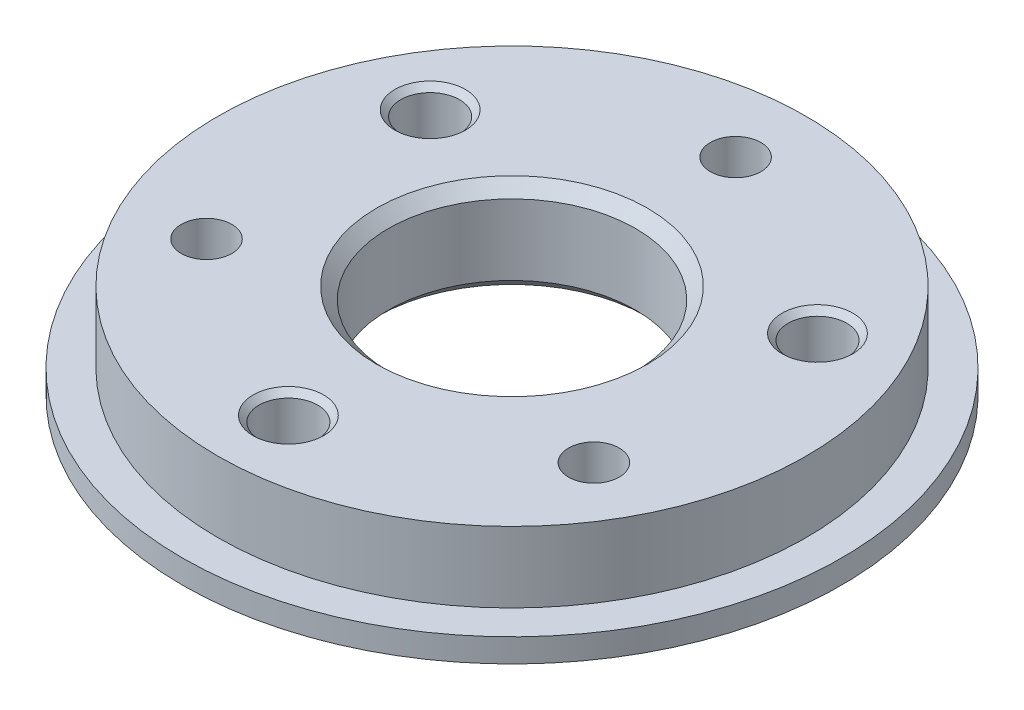
ISO-10303-21;
HEADER;
FILE_DESCRIPTION(('STEP AP214'),'2;1');
FILE_NAME('part.step','',(''),(''),'','','');
FILE_SCHEMA(('AUTOMOTIVE_DESIGN { 1 0 10303 214 1 1 1 1 }'));
ENDSEC;
DATA;
#1=APPLICATION_CONTEXT('core data for automotive mechanical design processes');
#2=APPLICATION_PROTOCOL_DEFINITION('international standard','automotive_design',2000,#1);
#3=PRODUCT_CONTEXT('',#1,'mechanical');
#4=PRODUCT('Part','Part','',(#3));
#5=PRODUCT_RELATED_PRODUCT_CATEGORY('part','',(#4));
#6=PRODUCT_DEFINITION_FORMATION('','',#4);
#7=PRODUCT_DEFINITION_CONTEXT('part definition',#1,'design');
#8=PRODUCT_DEFINITION('design','',#6,#7);
#9=PRODUCT_DEFINITION_SHAPE('','',#8);
#10=(LENGTH_UNIT() NAMED_UNIT(*) SI_UNIT(.MILLI.,.METRE.));
#11=(NAMED_UNIT(*) PLANE_ANGLE_UNIT() SI_UNIT($,.RADIAN.));
#12=(NAMED_UNIT(*) SI_UNIT($,.STERADIAN.) SOLID_ANGLE_UNIT());
#13=UNCERTAINTY_MEASURE_WITH_UNIT(LENGTH_MEASURE(1.E-05),#10,'distance_accuracy_value','');
#14=(GEOMETRIC_REPRESENTATION_CONTEXT(3) GLOBAL_UNCERTAINTY_ASSIGNED_CONTEXT((#13)) GLOBAL_UNIT_ASSIGNED_CONTEXT((#10,
#11,#12)) REPRESENTATION_CONTEXT('',''));
#15=CARTESIAN_POINT('',(0.,0.,0.));
#16=DIRECTION('',(0.,0.,1.));
#17=DIRECTION('',(1.,0.,0.));
#18=AXIS2_PLACEMENT_3D('',#15,#16,#17);
#19=CARTESIAN_POINT('',(0.,6.,0.));
#20=DIRECTION('',(0.,1.,0.));
#21=DIRECTION('',(0.,0.,1.));
#22=AXIS2_PLACEMENT_3D('',#19,#20,#21);
#23=PLANE('',#22);
#24=CARTESIAN_POINT('',(16.4544826719043,6.,-9.50000000000001));
#25=DIRECTION('',(0.,1.,0.));
#26=DIRECTION('',(0.,0.,1.));
#27=AXIS2_PLACEMENT_3D('',#24,#25,#26);
#28=CIRCLE('',#27,3.00000000000001);
#29=CARTESIAN_POINT('',(16.4544826719043,6.,-6.5));
#30=VERTEX_POINT('',#29);
#31=EDGE_CURVE('E287',#30,#30,#28,.F.);
#32=ORIENTED_EDGE('',*,*,#31,.T.);
#33=EDGE_LOOP('',(#32));
#34=FACE_BOUND('',#33,.T.);
#35=CARTESIAN_POINT('',(-16.4544826719043,6.,-9.5));
#36=DIRECTION('',(0.,1.,0.));
#37=DIRECTION('',(0.,0.,1.));
#38=AXIS2_PLACEMENT_3D('',#35,#36,#37);
#39=CIRCLE('',#38,3.00000000000001);
#40=CARTESIAN_POINT('',(-16.4544826719043,6.,-6.49999999999999));
#41=VERTEX_POINT('',#40);
#42=EDGE_CURVE('E284',#41,#41,#39,.F.);
#43=ORIENTED_EDGE('',*,*,#42,.T.);
#44=EDGE_LOOP('',(#43));
#45=FACE_BOUND('',#44,.T.);
#46=CARTESIAN_POINT('',(0.,6.,19.));
#47=DIRECTION('',(0.,1.,0.));
#48=DIRECTION('',(0.,0.,1.));
#49=AXIS2_PLACEMENT_3D('',#46,#47,#48);
#50=CIRCLE('',#49,3.00000000000001);
#51=CARTESIAN_POINT('',(0.,6.,22.));
#52=VERTEX_POINT('',#51);
#53=EDGE_CURVE('E281',#52,#52,#50,.F.);
#54=ORIENTED_EDGE('',*,*,#53,.T.);
#55=EDGE_LOOP('',(#54));
#56=FACE_BOUND('',#55,.T.);
#57=CARTESIAN_POINT('',(0.,6.,0.));
#58=DIRECTION('',(0.,1.,0.));
#59=DIRECTION('',(0.,0.,1.));
#60=AXIS2_PLACEMENT_3D('',#57,#58,#59);
#61=CIRCLE('',#60,11.5);
#62=CARTESIAN_POINT('',(0.,6.,11.5));
#63=VERTEX_POINT('',#62);
#64=EDGE_CURVE('E272',#63,#63,#61,.F.);
#65=ORIENTED_EDGE('',*,*,#64,.T.);
#66=EDGE_LOOP('',(#65));
#67=FACE_BOUND('',#66,.T.);
#68=CARTESIAN_POINT('',(0.,6.,-19.));
#69=DIRECTION('',(0.,1.,0.));
#70=DIRECTION('',(0.,0.,1.));
#71=AXIS2_PLACEMENT_3D('',#68,#69,#70);
#72=CIRCLE('',#71,2.15);
#73=CARTESIAN_POINT('',(0.,6.,-16.85));
#74=VERTEX_POINT('',#73);
#75=EDGE_CURVE('E248',#74,#74,#72,.T.);
#76=ORIENTED_EDGE('',*,*,#75,.F.);
#77=EDGE_LOOP('',(#76));
#78=FACE_BOUND('',#77,.T.);
#79=CARTESIAN_POINT('',(16.4544826719043,6.,9.5));
#80=DIRECTION('',(0.,1.,0.));
#81=DIRECTION('',(0.,0.,1.));
#82=AXIS2_PLACEMENT_3D('',#79,#80,#81);
#83=CIRCLE('',#82,2.15);
#84=CARTESIAN_POINT('',(16.4544826719043,6.,11.65));
#85=VERTEX_POINT('',#84);
#86=EDGE_CURVE('E254',#85,#85,#83,.T.);
#87=ORIENTED_EDGE('',*,*,#86,.F.);
#88=EDGE_LOOP('',(#87));
#89=FACE_BOUND('',#88,.T.);
#90=CARTESIAN_POINT('',(-16.4544826719043,6.,9.50000000000001));
#91=DIRECTION('',(0.,1.,0.));
#92=DIRECTION('',(0.,0.,1.));
#93=AXIS2_PLACEMENT_3D('',#90,#91,#92);
#94=CIRCLE('',#93,2.15);
#95=CARTESIAN_POINT('',(-16.4544826719043,6.,11.65));
#96=VERTEX_POINT('',#95);
#97=EDGE_CURVE('E237',#96,#96,#94,.T.);
#98=ORIENTED_EDGE('',*,*,#97,.F.);
#99=EDGE_LOOP('',(#98));
#100=FACE_BOUND('',#99,.T.);
#101=CARTESIAN_POINT('',(0.,6.,0.));
#102=DIRECTION('',(0.,1.,0.));
#103=DIRECTION('',(0.,0.,1.));
#104=AXIS2_PLACEMENT_3D('',#101,#102,#103);
#105=CIRCLE('',#104,25.);
#106=CARTESIAN_POINT('',(0.,6.,25.));
#107=VERTEX_POINT('',#106);
#108=EDGE_CURVE('E247',#107,#107,#105,.T.);
#109=ORIENTED_EDGE('',*,*,#108,.T.);
#110=EDGE_LOOP('',(#109));
#111=FACE_BOUND('',#110,.T.);
#112=ADVANCED_FACE('F44',(#34,#45,#56,#67,#78,#89,#100,#111),#23,.T.);
#113=CARTESIAN_POINT('',(0.,6.,0.));
#114=DIRECTION('',(0.,-1.,0.));
#115=DIRECTION('',(0.,0.,-1.));
#116=AXIS2_PLACEMENT_3D('',#113,#114,#115);
#117=CYLINDRICAL_SURFACE('',#116,25.);
#118=ORIENTED_EDGE('',*,*,#108,.F.);
#119=EDGE_LOOP('',(#118));
#120=FACE_BOUND('',#119,.T.);
#121=CARTESIAN_POINT('',(0.,0.,0.));
#122=DIRECTION('',(0.,1.,0.));
#123=DIRECTION('',(0.,0.,1.));
#124=AXIS2_PLACEMENT_3D('',#121,#122,#123);
#125=CIRCLE('',#124,25.);
#126=CARTESIAN_POINT('',(0.,0.,25.));
#127=VERTEX_POINT('',#126);
#128=EDGE_CURVE('E231',#127,#127,#125,.T.);
#129=ORIENTED_EDGE('',*,*,#128,.T.);
#130=EDGE_LOOP('',(#129));
#131=FACE_BOUND('',#130,.T.);
#132=ADVANCED_FACE('F321',(#120,#131),#117,.T.);
#133=CARTESIAN_POINT('',(0.,6.,0.));
#134=DIRECTION('',(0.,-1.,0.));
#135=DIRECTION('',(0.,0.,-1.));
#136=AXIS2_PLACEMENT_3D('',#133,#134,#135);
#137=CYLINDRICAL_SURFACE('',#136,10.5);
#138=CARTESIAN_POINT('',(0.,5.,0.));
#139=DIRECTION('',(0.,1.,0.));
#140=DIRECTION('',(0.,0.,1.));
#141=AXIS2_PLACEMENT_3D('',#138,#139,#140);
#142=CIRCLE('',#141,10.5);
#143=CARTESIAN_POINT('',(0.,5.,10.5));
#144=VERTEX_POINT('',#143);
#145=EDGE_CURVE('E269',#144,#144,#142,.T.);
#146=ORIENTED_EDGE('',*,*,#145,.T.);
#147=EDGE_LOOP('',(#146));
#148=FACE_BOUND('',#147,.T.);
#149=CARTESIAN_POINT('',(0.,-1.00000000000002,0.));
#150=DIRECTION('',(0.,-1.,0.));
#151=DIRECTION('',(0.,0.,-1.));
#152=AXIS2_PLACEMENT_3D('',#149,#150,#151);
#153=CIRCLE('',#152,10.5);
#154=CARTESIAN_POINT('',(0.,-1.00000000000002,-10.5));
#155=VERTEX_POINT('',#154);
#156=EDGE_CURVE('E264',#155,#155,#153,.T.);
#157=ORIENTED_EDGE('',*,*,#156,.T.);
#158=EDGE_LOOP('',(#157));
#159=FACE_BOUND('',#158,.T.);
#160=ADVANCED_FACE('F327',(#148,#159),#137,.F.);
#161=CARTESIAN_POINT('',(-16.4544826719043,0.,9.50000000000001));
#162=DIRECTION('',(0.,1.,0.));
#163=DIRECTION('',(0.,0.,1.));
#164=AXIS2_PLACEMENT_3D('',#161,#162,#163);
#165=CYLINDRICAL_SURFACE('',#164,2.15);
#166=CARTESIAN_POINT('',(-16.4544826719043,0.,9.50000000000001));
#167=DIRECTION('',(0.,1.,0.));
#168=DIRECTION('',(0.,0.,1.));
#169=AXIS2_PLACEMENT_3D('',#166,#167,#168);
#170=CIRCLE('',#169,2.15);
#171=CARTESIAN_POINT('',(-16.4544826719043,0.,11.65));
#172=VERTEX_POINT('',#171);
#173=EDGE_CURVE('E257',#172,#172,#170,.T.);
#174=ORIENTED_EDGE('',*,*,#173,.F.);
#175=EDGE_LOOP('',(#174));
#176=FACE_BOUND('',#175,.T.);
#177=ORIENTED_EDGE('',*,*,#97,.T.);
#178=EDGE_LOOP('',(#177));
#179=FACE_BOUND('',#178,.T.);
#180=ADVANCED_FACE('F404',(#176,#179),#165,.F.);
#181=CARTESIAN_POINT('',(16.4544826719043,0.,9.5));
#182=DIRECTION('',(0.,1.,0.));
#183=DIRECTION('',(0.,0.,1.));
#184=AXIS2_PLACEMENT_3D('',#181,#182,#183);
#185=CYLINDRICAL_SURFACE('',#184,2.15);
#186=CARTESIAN_POINT('',(16.4544826719043,0.,9.5));
#187=DIRECTION('',(0.,1.,0.));
#188=DIRECTION('',(0.,0.,1.));
#189=AXIS2_PLACEMENT_3D('',#186,#187,#188);
#190=CIRCLE('',#189,2.15);
#191=CARTESIAN_POINT('',(16.4544826719043,0.,11.65));
#192=VERTEX_POINT('',#191);
#193=EDGE_CURVE('E251',#192,#192,#190,.T.);
#194=ORIENTED_EDGE('',*,*,#193,.F.);
#195=EDGE_LOOP('',(#194));
#196=FACE_BOUND('',#195,.T.);
#197=ORIENTED_EDGE('',*,*,#86,.T.);
#198=EDGE_LOOP('',(#197));
#199=FACE_BOUND('',#198,.T.);
#200=ADVANCED_FACE('F401',(#196,#199),#185,.F.);
#201=CARTESIAN_POINT('',(0.,0.,-19.));
#202=DIRECTION('',(0.,1.,0.));
#203=DIRECTION('',(0.,0.,1.));
#204=AXIS2_PLACEMENT_3D('',#201,#202,#203);
#205=CYLINDRICAL_SURFACE('',#204,2.15);
#206=CARTESIAN_POINT('',(0.,0.,-19.));
#207=DIRECTION('',(0.,1.,0.));
#208=DIRECTION('',(0.,0.,1.));
#209=AXIS2_PLACEMENT_3D('',#206,#207,#208);
#210=CIRCLE('',#209,2.15);
#211=CARTESIAN_POINT('',(0.,0.,-16.85));
#212=VERTEX_POINT('',#211);
#213=EDGE_CURVE('E244',#212,#212,#210,.T.);
#214=ORIENTED_EDGE('',*,*,#213,.F.);
#215=EDGE_LOOP('',(#214));
#216=FACE_BOUND('',#215,.T.);
#217=ORIENTED_EDGE('',*,*,#75,.T.);
#218=EDGE_LOOP('',(#217));
#219=FACE_BOUND('',#218,.T.);
#220=ADVANCED_FACE('F397',(#216,#219),#205,.F.);
#221=CARTESIAN_POINT('',(16.4544826719043,1.,-9.50000000000001));
#222=DIRECTION('',(0.,1.,0.));
#223=DIRECTION('',(0.,0.,1.));
#224=AXIS2_PLACEMENT_3D('',#221,#222,#223);
#225=CYLINDRICAL_SURFACE('',#224,2.5);
#226=CARTESIAN_POINT('',(16.4544826719043,5.49999999999999,-9.50000000000001));
#227=DIRECTION('',(0.,1.,0.));
#228=DIRECTION('',(0.,0.,1.));
#229=AXIS2_PLACEMENT_3D('',#226,#227,#228);
#230=CIRCLE('',#229,2.5);
#231=CARTESIAN_POINT('',(16.4544826719043,5.49999999999999,-7.00000000000001));
#232=VERTEX_POINT('',#231);
#233=EDGE_CURVE('E278',#232,#232,#230,.T.);
#234=ORIENTED_EDGE('',*,*,#233,.T.);
#235=EDGE_LOOP('',(#234));
#236=FACE_BOUND('',#235,.T.);
#237=CARTESIAN_POINT('',(16.4544826719043,1.,-9.50000000000001));
#238=DIRECTION('',(0.,1.,0.));
#239=DIRECTION('',(0.,0.,1.));
#240=AXIS2_PLACEMENT_3D('',#237,#238,#239);
#241=CIRCLE('',#240,2.5);
#242=CARTESIAN_POINT('',(16.4544826719043,1.,-7.00000000000001));
#243=VERTEX_POINT('',#242);
#244=EDGE_CURVE('E241',#243,#243,#241,.T.);
#245=ORIENTED_EDGE('',*,*,#244,.F.);
#246=EDGE_LOOP('',(#245));
#247=FACE_BOUND('',#246,.T.);
#248=ADVANCED_FACE('F393',(#236,#247),#225,.F.);
#249=CARTESIAN_POINT('',(16.4544826719043,1.,-9.50000000000001));
#250=DIRECTION('',(0.,1.,0.));
#251=DIRECTION('',(0.,0.,1.));
#252=AXIS2_PLACEMENT_3D('',#249,#250,#251);
#253=PLANE('',#252);
#254=ORIENTED_EDGE('',*,*,#244,.T.);
#255=EDGE_LOOP('',(#254));
#256=FACE_BOUND('',#255,.T.);
#257=ADVANCED_FACE('F376',(#256),#253,.T.);
#258=CARTESIAN_POINT('',(-16.4544826719043,1.,-9.5));
#259=DIRECTION('',(0.,1.,0.));
#260=DIRECTION('',(0.,0.,1.));
#261=AXIS2_PLACEMENT_3D('',#258,#259,#260);
#262=CYLINDRICAL_SURFACE('',#261,2.5);
#263=CARTESIAN_POINT('',(-16.4544826719043,5.49999999999999,-9.5));
#264=DIRECTION('',(0.,1.,0.));
#265=DIRECTION('',(0.,0.,1.));
#266=AXIS2_PLACEMENT_3D('',#263,#264,#265);
#267=CIRCLE('',#266,2.5);
#268=CARTESIAN_POINT('',(-16.4544826719043,5.49999999999999,-7.));
#269=VERTEX_POINT('',#268);
#270=EDGE_CURVE('E290',#269,#269,#267,.T.);
#271=ORIENTED_EDGE('',*,*,#270,.T.);
#272=EDGE_LOOP('',(#271));
#273=FACE_BOUND('',#272,.T.);
#274=CARTESIAN_POINT('',(-16.4544826719043,1.,-9.5));
#275=DIRECTION('',(0.,1.,0.));
#276=DIRECTION('',(0.,0.,1.));
#277=AXIS2_PLACEMENT_3D('',#274,#275,#276);
#278=CIRCLE('',#277,2.5);
#279=CARTESIAN_POINT('',(-16.4544826719043,1.,-7.));
#280=VERTEX_POINT('',#279);
#281=EDGE_CURVE('E238',#280,#280,#278,.T.);
#282=ORIENTED_EDGE('',*,*,#281,.F.);
#283=EDGE_LOOP('',(#282));
#284=FACE_BOUND('',#283,.T.);
#285=ADVANCED_FACE('F372',(#273,#284),#262,.F.);
#286=CARTESIAN_POINT('',(-16.4544826719043,1.,-9.5));
#287=DIRECTION('',(0.,1.,0.));
#288=DIRECTION('',(0.,0.,1.));
#289=AXIS2_PLACEMENT_3D('',#286,#287,#288);
#290=PLANE('',#289);
#291=ORIENTED_EDGE('',*,*,#281,.T.);
#292=EDGE_LOOP('',(#291));
#293=FACE_BOUND('',#292,.T.);
#294=ADVANCED_FACE('F375',(#293),#290,.T.);
#295=CARTESIAN_POINT('',(0.,1.,19.));
#296=DIRECTION('',(0.,1.,0.));
#297=DIRECTION('',(0.,0.,1.));
#298=AXIS2_PLACEMENT_3D('',#295,#296,#297);
#299=CYLINDRICAL_SURFACE('',#298,2.5);
#300=CARTESIAN_POINT('',(0.,5.5,19.));
#301=DIRECTION('',(0.,1.,0.));
#302=DIRECTION('',(0.,0.,1.));
#303=AXIS2_PLACEMENT_3D('',#300,#301,#302);
#304=CIRCLE('',#303,2.5);
#305=CARTESIAN_POINT('',(0.,5.5,21.5));
#306=VERTEX_POINT('',#305);
#307=EDGE_CURVE('E293',#306,#306,#304,.T.);
#308=ORIENTED_EDGE('',*,*,#307,.T.);
#309=EDGE_LOOP('',(#308));
#310=FACE_BOUND('',#309,.T.);
#311=CARTESIAN_POINT('',(0.,1.,19.));
#312=DIRECTION('',(0.,1.,0.));
#313=DIRECTION('',(0.,0.,1.));
#314=AXIS2_PLACEMENT_3D('',#311,#312,#313);
#315=CIRCLE('',#314,2.5);
#316=CARTESIAN_POINT('',(0.,1.,21.5));
#317=VERTEX_POINT('',#316);
#318=EDGE_CURVE('E234',#317,#317,#315,.T.);
#319=ORIENTED_EDGE('',*,*,#318,.F.);
#320=EDGE_LOOP('',(#319));
#321=FACE_BOUND('',#320,.T.);
#322=ADVANCED_FACE('F381',(#310,#321),#299,.F.);
#323=CARTESIAN_POINT('',(0.,1.,19.));
#324=DIRECTION('',(0.,1.,0.));
#325=DIRECTION('',(0.,0.,1.));
#326=AXIS2_PLACEMENT_3D('',#323,#324,#325);
#327=PLANE('',#326);
#328=ORIENTED_EDGE('',*,*,#318,.T.);
#329=EDGE_LOOP('',(#328));
#330=FACE_BOUND('',#329,.T.);
#331=ADVANCED_FACE('F386',(#330),#327,.T.);
#332=CARTESIAN_POINT('',(0.,-2.,0.));
#333=DIRECTION('',(0.,1.,0.));
#334=DIRECTION('',(0.,0.,1.));
#335=AXIS2_PLACEMENT_3D('',#332,#333,#334);
#336=CYLINDRICAL_SURFACE('',#335,28.);
#337=CARTESIAN_POINT('',(0.,-2.,0.));
#338=DIRECTION('',(0.,-1.,0.));
#339=DIRECTION('',(0.,0.,-1.));
#340=AXIS2_PLACEMENT_3D('',#337,#338,#339);
#341=CIRCLE('',#340,28.);
#342=CARTESIAN_POINT('',(0.,-2.,-28.));
#343=VERTEX_POINT('',#342);
#344=EDGE_CURVE('E228',#343,#343,#341,.T.);
#345=ORIENTED_EDGE('',*,*,#344,.F.);
#346=EDGE_LOOP('',(#345));
#347=FACE_BOUND('',#346,.T.);
#348=CARTESIAN_POINT('',(0.,0.,0.));
#349=DIRECTION('',(0.,-1.,0.));
#350=DIRECTION('',(0.,0.,-1.));
#351=AXIS2_PLACEMENT_3D('',#348,#349,#350);
#352=CIRCLE('',#351,28.);
#353=CARTESIAN_POINT('',(0.,0.,-28.));
#354=VERTEX_POINT('',#353);
#355=EDGE_CURVE('E201',#354,#354,#352,.T.);
#356=ORIENTED_EDGE('',*,*,#355,.T.);
#357=EDGE_LOOP('',(#356));
#358=FACE_BOUND('',#357,.T.);
#359=ADVANCED_FACE('F425',(#347,#358),#336,.T.);
#360=CARTESIAN_POINT('',(0.,0.,0.));
#361=DIRECTION('',(0.,-1.,0.));
#362=DIRECTION('',(0.,0.,-1.));
#363=AXIS2_PLACEMENT_3D('',#360,#361,#362);
#364=PLANE('',#363);
#365=ORIENTED_EDGE('',*,*,#128,.F.);
#366=EDGE_LOOP('',(#365));
#367=FACE_BOUND('',#366,.T.);
#368=ORIENTED_EDGE('',*,*,#355,.F.);
#369=EDGE_LOOP('',(#368));
#370=FACE_BOUND('',#369,.T.);
#371=ADVANCED_FACE('F421',(#367,#370),#364,.F.);
#372=CARTESIAN_POINT('',(0.,-2.,0.));
#373=DIRECTION('',(0.,-1.,0.));
#374=DIRECTION('',(0.,0.,-1.));
#375=AXIS2_PLACEMENT_3D('',#372,#373,#374);
#376=PLANE('',#375);
#377=CARTESIAN_POINT('',(-10.000000000001,-2.,17.3205080756871));
#378=DIRECTION('',(0.,-1.,0.));
#379=DIRECTION('',(0.,0.,-1.));
#380=AXIS2_PLACEMENT_3D('',#377,#378,#379);
#381=CIRCLE('',#380,1.24999999999999);
#382=CARTESIAN_POINT('',(-11.0822816681333,-2.,17.9459410383815));
#383=VERTEX_POINT('',#382);
#384=CARTESIAN_POINT('',(-8.9172183318808,-2.,16.6959411383754));
#385=VERTEX_POINT('',#384);
#386=EDGE_CURVE('E11',#383,#385,#381,.T.);
#387=ORIENTED_EDGE('',*,*,#386,.F.);
#388=CARTESIAN_POINT('',(-9.99949999999906,-2.,17.3213741010942));
#389=DIRECTION('',(0.,-1.,0.));
#390=DIRECTION('',(0.,0.,-1.));
#391=AXIS2_PLACEMENT_3D('',#388,#389,#390);
#392=CIRCLE('',#391,1.25);
#393=EDGE_CURVE('E208',#385,#383,#392,.T.);
#394=ORIENTED_EDGE('',*,*,#393,.F.);
#395=EDGE_LOOP('',(#387,#394));
#396=FACE_BOUND('',#395,.T.);
#397=CARTESIAN_POINT('',(9.99999999999905,-2.,17.3205080756882));
#398=DIRECTION('',(0.,-1.,0.));
#399=DIRECTION('',(0.,0.,-1.));
#400=AXIS2_PLACEMENT_3D('',#397,#398,#399);
#401=CIRCLE('',#400,1.24999999999999);
#402=CARTESIAN_POINT('',(9.37575014998819,-2.,18.4034725833067));
#403=VERTEX_POINT('',#402);
#404=CARTESIAN_POINT('',(10.6257498499983,-2.,16.2384095934668));
#405=VERTEX_POINT('',#404);
#406=EDGE_CURVE('E151',#403,#405,#401,.T.);
#407=ORIENTED_EDGE('',*,*,#406,.F.);
#408=CARTESIAN_POINT('',(10.0015000000028,-2.,17.3213741010942));
#409=DIRECTION('',(0.,-1.,0.));
#410=DIRECTION('',(0.,0.,-1.));
#411=AXIS2_PLACEMENT_3D('',#408,#409,#410);
#412=CIRCLE('',#411,1.25);
#413=EDGE_CURVE('E214',#405,#403,#412,.T.);
#414=ORIENTED_EDGE('',*,*,#413,.F.);
#415=EDGE_LOOP('',(#407,#414));
#416=FACE_BOUND('',#415,.T.);
#417=CARTESIAN_POINT('',(20.,-2.,0.));
#418=DIRECTION('',(0.,-1.,0.));
#419=DIRECTION('',(0.,0.,-1.));
#420=AXIS2_PLACEMENT_3D('',#417,#418,#419);
#421=CIRCLE('',#420,1.24999999999999);
#422=CARTESIAN_POINT('',(20.0009999999976,-2.,1.24999959999993));
#423=VERTEX_POINT('',#422);
#424=CARTESIAN_POINT('',(20.0009999999954,-2.,-1.24999959999993));
#425=VERTEX_POINT('',#424);
#426=EDGE_CURVE('E160',#423,#425,#421,.T.);
#427=ORIENTED_EDGE('',*,*,#426,.F.);
#428=CARTESIAN_POINT('',(20.0020000000038,-2.,0.));
#429=DIRECTION('',(0.,-1.,0.));
#430=DIRECTION('',(0.,0.,-1.));
#431=AXIS2_PLACEMENT_3D('',#428,#429,#430);
#432=CIRCLE('',#431,1.25);
#433=EDGE_CURVE('E220',#425,#423,#432,.T.);
#434=ORIENTED_EDGE('',*,*,#433,.F.);
#435=EDGE_LOOP('',(#427,#434));
#436=FACE_BOUND('',#435,.T.);
#437=CARTESIAN_POINT('',(10.000000000001,-2.,-17.3205080756893));
#438=DIRECTION('',(0.,-1.,0.));
#439=DIRECTION('',(0.,0.,-1.));
#440=AXIS2_PLACEMENT_3D('',#437,#438,#439);
#441=CIRCLE('',#440,1.24999999999999);
#442=CARTESIAN_POINT('',(10.6257498499916,-2.,-16.238409593463));
#443=VERTEX_POINT('',#442);
#444=CARTESIAN_POINT('',(9.37575015000215,-2.,-18.4034725833148));
#445=VERTEX_POINT('',#444);
#446=EDGE_CURVE('E171',#443,#445,#441,.T.);
#447=ORIENTED_EDGE('',*,*,#446,.F.);
#448=CARTESIAN_POINT('',(10.0015000000029,-2.,-17.3213741010942));
#449=DIRECTION('',(0.,-1.,0.));
#450=DIRECTION('',(0.,0.,-1.));
#451=AXIS2_PLACEMENT_3D('',#448,#449,#450);
#452=CIRCLE('',#451,1.25);
#453=EDGE_CURVE('E205',#445,#443,#452,.T.);
#454=ORIENTED_EDGE('',*,*,#453,.F.);
#455=EDGE_LOOP('',(#447,#454));
#456=FACE_BOUND('',#455,.T.);
#457=CARTESIAN_POINT('',(-20.,-2.,0.));
#458=DIRECTION('',(0.,-1.,0.));
#459=DIRECTION('',(0.,0.,-1.));
#460=AXIS2_PLACEMENT_3D('',#457,#458,#459);
#461=CIRCLE('',#460,1.25);
#462=CARTESIAN_POINT('',(-20.,-2.,-1.25));
#463=VERTEX_POINT('',#462);
#464=EDGE_CURVE('E198',#463,#463,#461,.T.);
#465=ORIENTED_EDGE('',*,*,#464,.F.);
#466=EDGE_LOOP('',(#465));
#467=FACE_BOUND('',#466,.T.);
#468=CARTESIAN_POINT('',(-9.99949999999904,-2.,-17.3213741010942));
#469=DIRECTION('',(0.,-1.,0.));
#470=DIRECTION('',(0.,0.,-1.));
#471=AXIS2_PLACEMENT_3D('',#468,#469,#470);
#472=CIRCLE('',#471,1.25);
#473=CARTESIAN_POINT('',(-9.99949999999904,-2.,-18.5713741010942));
#474=VERTEX_POINT('',#473);
#475=EDGE_CURVE('E197',#474,#474,#472,.T.);
#476=ORIENTED_EDGE('',*,*,#475,.F.);
#477=EDGE_LOOP('',(#476));
#478=FACE_BOUND('',#477,.T.);
#479=CARTESIAN_POINT('',(0.,-2.,0.));
#480=DIRECTION('',(0.,-1.,0.));
#481=DIRECTION('',(0.,0.,-1.));
#482=AXIS2_PLACEMENT_3D('',#479,#480,#481);
#483=CIRCLE('',#482,11.5);
#484=CARTESIAN_POINT('',(0.,-2.,-11.5));
#485=VERTEX_POINT('',#484);
#486=EDGE_CURVE('E275',#485,#485,#483,.F.);
#487=ORIENTED_EDGE('',*,*,#486,.T.);
#488=EDGE_LOOP('',(#487));
#489=FACE_BOUND('',#488,.T.);
#490=ORIENTED_EDGE('',*,*,#344,.T.);
#491=EDGE_LOOP('',(#490));
#492=FACE_BOUND('',#491,.T.);
#493=ADVANCED_FACE('F424',(#396,#416,#436,#456,#467,#478,#489,#492),#376,.T.);
#494=CARTESIAN_POINT('',(-16.4544826719043,0.,9.50000000000001));
#495=DIRECTION('',(0.,1.,0.));
#496=DIRECTION('',(0.,0.,1.));
#497=AXIS2_PLACEMENT_3D('',#494,#495,#496);
#498=CIRCLE('',#497,2.1);
#499=CARTESIAN_POINT('',(-16.4544826719043,0.,11.6));
#500=VERTEX_POINT('',#499);
#501=EDGE_CURVE('E188',#500,#500,#498,.T.);
#502=ORIENTED_EDGE('',*,*,#501,.F.);
#503=EDGE_LOOP('',(#502));
#504=FACE_BOUND('',#503,.T.);
#505=ORIENTED_EDGE('',*,*,#173,.T.);
#506=EDGE_LOOP('',(#505));
#507=FACE_BOUND('',#506,.T.);
#508=ADVANCED_FACE('F427',(#504,#507),#364,.F.);
#509=CARTESIAN_POINT('',(16.4544826719043,0.,9.5));
#510=DIRECTION('',(0.,1.,0.));
#511=DIRECTION('',(0.,0.,1.));
#512=AXIS2_PLACEMENT_3D('',#509,#510,#511);
#513=CIRCLE('',#512,2.1);
#514=CARTESIAN_POINT('',(16.4544826719043,0.,11.6));
#515=VERTEX_POINT('',#514);
#516=EDGE_CURVE('E194',#515,#515,#513,.T.);
#517=ORIENTED_EDGE('',*,*,#516,.F.);
#518=EDGE_LOOP('',(#517));
#519=FACE_BOUND('',#518,.T.);
#520=ORIENTED_EDGE('',*,*,#193,.T.);
#521=EDGE_LOOP('',(#520));
#522=FACE_BOUND('',#521,.T.);
#523=ADVANCED_FACE('F657',(#519,#522),#364,.F.);
#524=CARTESIAN_POINT('',(0.,0.,-19.));
#525=DIRECTION('',(0.,1.,0.));
#526=DIRECTION('',(0.,0.,1.));
#527=AXIS2_PLACEMENT_3D('',#524,#525,#526);
#528=CIRCLE('',#527,2.1);
#529=CARTESIAN_POINT('',(0.,0.,-16.9));
#530=VERTEX_POINT('',#529);
#531=EDGE_CURVE('E191',#530,#530,#528,.T.);
#532=ORIENTED_EDGE('',*,*,#531,.F.);
#533=EDGE_LOOP('',(#532));
#534=FACE_BOUND('',#533,.T.);
#535=ORIENTED_EDGE('',*,*,#213,.T.);
#536=EDGE_LOOP('',(#535));
#537=FACE_BOUND('',#536,.T.);
#538=ADVANCED_FACE('F342',(#534,#537),#364,.F.);
#539=CARTESIAN_POINT('',(0.,5.,0.));
#540=DIRECTION('',(0.,1.,0.));
#541=DIRECTION('',(0.,0.,1.));
#542=AXIS2_PLACEMENT_3D('',#539,#540,#541);
#543=CONICAL_SURFACE('',#542,10.5,0.785398163397447);
#544=ORIENTED_EDGE('',*,*,#64,.F.);
#545=EDGE_LOOP('',(#544));
#546=FACE_BOUND('',#545,.T.);
#547=ORIENTED_EDGE('',*,*,#145,.F.);
#548=EDGE_LOOP('',(#547));
#549=FACE_BOUND('',#548,.T.);
#550=ADVANCED_FACE('F335',(#546,#549),#543,.F.);
#551=CARTESIAN_POINT('',(0.,-1.00000000000002,0.));
#552=DIRECTION('',(0.,-1.,0.));
#553=DIRECTION('',(0.,0.,-1.));
#554=AXIS2_PLACEMENT_3D('',#551,#552,#553);
#555=CONICAL_SURFACE('',#554,10.5,0.785398163397453);
#556=ORIENTED_EDGE('',*,*,#486,.F.);
#557=EDGE_LOOP('',(#556));
#558=FACE_BOUND('',#557,.T.);
#559=ORIENTED_EDGE('',*,*,#156,.F.);
#560=EDGE_LOOP('',(#559));
#561=FACE_BOUND('',#560,.T.);
#562=ADVANCED_FACE('F341',(#558,#561),#555,.F.);
#563=CARTESIAN_POINT('',(-9.99949999999906,3.,17.3213741010942));
#564=DIRECTION('',(0.,-1.,0.));
#565=DIRECTION('',(0.,0.,-1.));
#566=AXIS2_PLACEMENT_3D('',#563,#564,#565);
#567=CYLINDRICAL_SURFACE('',#566,1.25);
#568=CARTESIAN_POINT('',(-9.99949999999906,3.,17.3213741010942));
#569=DIRECTION('',(0.,-1.,0.));
#570=DIRECTION('',(0.,0.,-1.));
#571=AXIS2_PLACEMENT_3D('',#568,#569,#570);
#572=CIRCLE('',#571,1.25);
#573=CARTESIAN_POINT('',(-8.9172183318808,3.,16.6959411383754));
#574=VERTEX_POINT('',#573);
#575=CARTESIAN_POINT('',(-11.0822816681333,3.,17.9459410383815));
#576=VERTEX_POINT('',#575);
#577=EDGE_CURVE('E202',#574,#576,#572,.T.);
#578=ORIENTED_EDGE('',*,*,#577,.F.);
#579=DIRECTION('',(0.,-1.,0.));
#580=VECTOR('',#579,1.);
#581=CARTESIAN_POINT('',(-8.9172183318808,0.999999999999999,16.6959411383754));
#582=LINE('',#581,#580);
#583=EDGE_CURVE('E148',#574,#385,#582,.T.);
#584=ORIENTED_EDGE('',*,*,#583,.T.);
#585=ORIENTED_EDGE('',*,*,#393,.T.);
#586=DIRECTION('',(0.,-1.,0.));
#587=VECTOR('',#586,1.);
#588=CARTESIAN_POINT('',(-11.0822816681333,0.999999999999999,17.9459410383815));
#589=LINE('',#588,#587);
#590=EDGE_CURVE('E59',#383,#576,#589,.F.);
#591=ORIENTED_EDGE('',*,*,#590,.T.);
#592=EDGE_LOOP('',(#578,#584,#585,#591));
#593=FACE_BOUND('',#592,.T.);
#594=ADVANCED_FACE('F349',(#593),#567,.F.);
#595=CARTESIAN_POINT('',(-9.99949999999906,3.,17.3213741010942));
#596=DIRECTION('',(0.,-1.,0.));
#597=DIRECTION('',(0.,0.,-1.));
#598=AXIS2_PLACEMENT_3D('',#595,#596,#597);
#599=PLANE('',#598);
#600=CARTESIAN_POINT('',(-10.000000000001,3.,17.3205080756871));
#601=DIRECTION('',(0.,-1.,0.));
#602=DIRECTION('',(0.,0.,-1.));
#603=AXIS2_PLACEMENT_3D('',#600,#601,#602);
#604=CIRCLE('',#603,1.24999999999999);
#605=EDGE_CURVE('E144',#574,#576,#604,.T.);
#606=ORIENTED_EDGE('',*,*,#605,.F.);
#607=ORIENTED_EDGE('',*,*,#577,.T.);
#608=EDGE_LOOP('',(#606,#607));
#609=FACE_BOUND('',#608,.T.);
#610=ADVANCED_FACE('F317',(#609),#599,.T.);
#611=CARTESIAN_POINT('',(10.0015000000028,3.,17.3213741010942));
#612=DIRECTION('',(0.,-1.,0.));
#613=DIRECTION('',(0.,0.,-1.));
#614=AXIS2_PLACEMENT_3D('',#611,#612,#613);
#615=CYLINDRICAL_SURFACE('',#614,1.25);
#616=CARTESIAN_POINT('',(10.0015000000028,3.,17.3213741010942));
#617=DIRECTION('',(0.,-1.,0.));
#618=DIRECTION('',(0.,0.,-1.));
#619=AXIS2_PLACEMENT_3D('',#616,#617,#618);
#620=CIRCLE('',#619,1.25);
#621=CARTESIAN_POINT('',(10.6257498500015,3.,16.2384095934687));
#622=VERTEX_POINT('',#621);
#623=CARTESIAN_POINT('',(9.37575014999144,3.,18.4034725833086));
#624=VERTEX_POINT('',#623);
#625=EDGE_CURVE('E211',#622,#624,#620,.T.);
#626=ORIENTED_EDGE('',*,*,#625,.F.);
#627=DIRECTION('',(0.,-1.,0.));
#628=VECTOR('',#627,1.);
#629=CARTESIAN_POINT('',(10.6257498500015,0.999999999999999,16.2384095934687));
#630=LINE('',#629,#628);
#631=EDGE_CURVE('E67',#622,#405,#630,.T.);
#632=ORIENTED_EDGE('',*,*,#631,.T.);
#633=ORIENTED_EDGE('',*,*,#413,.T.);
#634=DIRECTION('',(0.,-1.,0.));
#635=VECTOR('',#634,1.);
#636=CARTESIAN_POINT('',(9.37575014999144,0.999999999999999,18.4034725833086));
#637=LINE('',#636,#635);
#638=EDGE_CURVE('E156',#403,#624,#637,.F.);
#639=ORIENTED_EDGE('',*,*,#638,.T.);
#640=EDGE_LOOP('',(#626,#632,#633,#639));
#641=FACE_BOUND('',#640,.T.);
#642=ADVANCED_FACE('F304',(#641),#615,.F.);
#643=CARTESIAN_POINT('',(10.0015000000028,3.,17.3213741010942));
#644=DIRECTION('',(0.,-1.,0.));
#645=DIRECTION('',(0.,0.,-1.));
#646=AXIS2_PLACEMENT_3D('',#643,#644,#645);
#647=PLANE('',#646);
#648=CARTESIAN_POINT('',(9.99999999999905,3.,17.3205080756882));
#649=DIRECTION('',(0.,-1.,0.));
#650=DIRECTION('',(0.,0.,-1.));
#651=AXIS2_PLACEMENT_3D('',#648,#649,#650);
#652=CIRCLE('',#651,1.24999999999999);
#653=EDGE_CURVE('E53',#622,#624,#652,.T.);
#654=ORIENTED_EDGE('',*,*,#653,.F.);
#655=ORIENTED_EDGE('',*,*,#625,.T.);
#656=EDGE_LOOP('',(#654,#655));
#657=FACE_BOUND('',#656,.T.);
#658=ADVANCED_FACE('F306',(#657),#647,.T.);
#659=CARTESIAN_POINT('',(20.0020000000038,3.,0.));
#660=DIRECTION('',(0.,-1.,0.));
#661=DIRECTION('',(0.,0.,-1.));
#662=AXIS2_PLACEMENT_3D('',#659,#660,#661);
#663=CYLINDRICAL_SURFACE('',#662,1.25);
#664=CARTESIAN_POINT('',(20.0020000000038,3.,0.));
#665=DIRECTION('',(0.,-1.,0.));
#666=DIRECTION('',(0.,0.,-1.));
#667=AXIS2_PLACEMENT_3D('',#664,#665,#666);
#668=CIRCLE('',#667,1.25);
#669=CARTESIAN_POINT('',(20.0009999999976,3.,-1.24999959999993));
#670=VERTEX_POINT('',#669);
#671=CARTESIAN_POINT('',(20.0009999999976,3.,1.24999959999994));
#672=VERTEX_POINT('',#671);
#673=EDGE_CURVE('E217',#670,#672,#668,.T.);
#674=ORIENTED_EDGE('',*,*,#673,.F.);
#675=DIRECTION('',(0.,-1.,0.));
#676=VECTOR('',#675,1.);
#677=CARTESIAN_POINT('',(20.0009999999976,0.999999999999999,-1.24999959999993));
#678=LINE('',#677,#676);
#679=EDGE_CURVE('E168',#670,#425,#678,.T.);
#680=ORIENTED_EDGE('',*,*,#679,.T.);
#681=ORIENTED_EDGE('',*,*,#433,.T.);
#682=DIRECTION('',(0.,-1.,0.));
#683=VECTOR('',#682,1.);
#684=CARTESIAN_POINT('',(20.0009999999976,0.999999999999999,1.24999959999994));
#685=LINE('',#684,#683);
#686=EDGE_CURVE('E165',#423,#672,#685,.F.);
#687=ORIENTED_EDGE('',*,*,#686,.T.);
#688=EDGE_LOOP('',(#674,#680,#681,#687));
#689=FACE_BOUND('',#688,.T.);
#690=ADVANCED_FACE('F308',(#689),#663,.F.);
#691=CARTESIAN_POINT('',(20.0020000000038,3.,0.));
#692=DIRECTION('',(0.,-1.,0.));
#693=DIRECTION('',(0.,0.,-1.));
#694=AXIS2_PLACEMENT_3D('',#691,#692,#693);
#695=PLANE('',#694);
#696=CARTESIAN_POINT('',(20.,3.,0.));
#697=DIRECTION('',(0.,-1.,0.));
#698=DIRECTION('',(0.,0.,-1.));
#699=AXIS2_PLACEMENT_3D('',#696,#697,#698);
#700=CIRCLE('',#699,1.24999999999999);
#701=EDGE_CURVE('E298',#670,#672,#700,.T.);
#702=ORIENTED_EDGE('',*,*,#701,.F.);
#703=ORIENTED_EDGE('',*,*,#673,.T.);
#704=EDGE_LOOP('',(#702,#703));
#705=FACE_BOUND('',#704,.T.);
#706=ADVANCED_FACE('F314',(#705),#695,.T.);
#707=CARTESIAN_POINT('',(10.0015000000029,3.,-17.3213741010942));
#708=DIRECTION('',(0.,-1.,0.));
#709=DIRECTION('',(0.,0.,-1.));
#710=AXIS2_PLACEMENT_3D('',#707,#708,#709);
#711=CYLINDRICAL_SURFACE('',#710,1.25);
#712=CARTESIAN_POINT('',(10.0015000000029,3.,-17.3213741010942));
#713=DIRECTION('',(0.,-1.,0.));
#714=DIRECTION('',(0.,0.,-1.));
#715=AXIS2_PLACEMENT_3D('',#712,#713,#714);
#716=CIRCLE('',#715,1.25);
#717=CARTESIAN_POINT('',(9.37575015000215,3.,-18.4034725833148));
#718=VERTEX_POINT('',#717);
#719=CARTESIAN_POINT('',(10.6257498499916,3.,-16.238409593463));
#720=VERTEX_POINT('',#719);
#721=EDGE_CURVE('E223',#718,#720,#716,.T.);
#722=ORIENTED_EDGE('',*,*,#721,.F.);
#723=DIRECTION('',(0.,-1.,0.));
#724=VECTOR('',#723,1.);
#725=CARTESIAN_POINT('',(9.37575015000215,0.999999999999999,-18.4034725833148));
#726=LINE('',#725,#724);
#727=EDGE_CURVE('E179',#718,#445,#726,.T.);
#728=ORIENTED_EDGE('',*,*,#727,.T.);
#729=ORIENTED_EDGE('',*,*,#453,.T.);
#730=DIRECTION('',(0.,-1.,0.));
#731=VECTOR('',#730,1.);
#732=CARTESIAN_POINT('',(10.6257498499916,0.999999999999999,-16.238409593463));
#733=LINE('',#732,#731);
#734=EDGE_CURVE('E176',#443,#720,#733,.F.);
#735=ORIENTED_EDGE('',*,*,#734,.T.);
#736=EDGE_LOOP('',(#722,#728,#729,#735));
#737=FACE_BOUND('',#736,.T.);
#738=ADVANCED_FACE('F442',(#737),#711,.F.);
#739=CARTESIAN_POINT('',(10.0015000000029,3.,-17.3213741010942));
#740=DIRECTION('',(0.,-1.,0.));
#741=DIRECTION('',(0.,0.,-1.));
#742=AXIS2_PLACEMENT_3D('',#739,#740,#741);
#743=PLANE('',#742);
#744=CARTESIAN_POINT('',(10.000000000001,3.,-17.3205080756893));
#745=DIRECTION('',(0.,-1.,0.));
#746=DIRECTION('',(0.,0.,-1.));
#747=AXIS2_PLACEMENT_3D('',#744,#745,#746);
#748=CIRCLE('',#747,1.24999999999999);
#749=EDGE_CURVE('E296',#718,#720,#748,.T.);
#750=ORIENTED_EDGE('',*,*,#749,.F.);
#751=ORIENTED_EDGE('',*,*,#721,.T.);
#752=EDGE_LOOP('',(#750,#751));
#753=FACE_BOUND('',#752,.T.);
#754=ADVANCED_FACE('F445',(#753),#743,.T.);
#755=CARTESIAN_POINT('',(-9.99949999999904,3.,-17.3213741010942));
#756=DIRECTION('',(0.,-1.,0.));
#757=DIRECTION('',(0.,0.,-1.));
#758=AXIS2_PLACEMENT_3D('',#755,#756,#757);
#759=CYLINDRICAL_SURFACE('',#758,1.25);
#760=ORIENTED_EDGE('',*,*,#475,.T.);
#761=EDGE_LOOP('',(#760));
#762=FACE_BOUND('',#761,.T.);
#763=CARTESIAN_POINT('',(-9.99949999999904,4.,-17.3213741010942));
#764=DIRECTION('',(0.,-1.,0.));
#765=DIRECTION('',(0.,0.,-1.));
#766=AXIS2_PLACEMENT_3D('',#763,#764,#765);
#767=CIRCLE('',#766,1.25);
#768=CARTESIAN_POINT('',(-9.99949999999904,4.,-18.5713741010942));
#769=VERTEX_POINT('',#768);
#770=EDGE_CURVE('E182',#769,#769,#767,.T.);
#771=ORIENTED_EDGE('',*,*,#770,.F.);
#772=EDGE_LOOP('',(#771));
#773=FACE_BOUND('',#772,.T.);
#774=ADVANCED_FACE('F448',(#762,#773),#759,.F.);
#775=CARTESIAN_POINT('',(-20.,3.,0.));
#776=DIRECTION('',(0.,-1.,0.));
#777=DIRECTION('',(0.,0.,-1.));
#778=AXIS2_PLACEMENT_3D('',#775,#776,#777);
#779=CYLINDRICAL_SURFACE('',#778,1.25);
#780=ORIENTED_EDGE('',*,*,#464,.T.);
#781=EDGE_LOOP('',(#780));
#782=FACE_BOUND('',#781,.T.);
#783=CARTESIAN_POINT('',(-20.,4.,-2.21105855556812E-12));
#784=DIRECTION('',(0.,-1.,0.));
#785=DIRECTION('',(0.,0.,-1.));
#786=AXIS2_PLACEMENT_3D('',#783,#784,#785);
#787=CIRCLE('',#786,1.25);
#788=CARTESIAN_POINT('',(-20.,4.,-1.25000000000221));
#789=VERTEX_POINT('',#788);
#790=EDGE_CURVE('E185',#789,#789,#787,.T.);
#791=ORIENTED_EDGE('',*,*,#790,.F.);
#792=EDGE_LOOP('',(#791));
#793=FACE_BOUND('',#792,.T.);
#794=ADVANCED_FACE('F357',(#782,#793),#779,.F.);
#795=CARTESIAN_POINT('',(16.4544826719043,5.49999999999999,-9.50000000000001));
#796=DIRECTION('',(0.,1.,0.));
#797=DIRECTION('',(0.,0.,1.));
#798=AXIS2_PLACEMENT_3D('',#795,#796,#797);
#799=CONICAL_SURFACE('',#798,2.5,0.785398163397453);
#800=ORIENTED_EDGE('',*,*,#31,.F.);
#801=EDGE_LOOP('',(#800));
#802=FACE_BOUND('',#801,.T.);
#803=ORIENTED_EDGE('',*,*,#233,.F.);
#804=EDGE_LOOP('',(#803));
#805=FACE_BOUND('',#804,.T.);
#806=ADVANCED_FACE('F351',(#802,#805),#799,.F.);
#807=CARTESIAN_POINT('',(-16.4544826719043,5.49999999999999,-9.5));
#808=DIRECTION('',(0.,1.,0.));
#809=DIRECTION('',(0.,0.,1.));
#810=AXIS2_PLACEMENT_3D('',#807,#808,#809);
#811=CONICAL_SURFACE('',#810,2.5,0.785398163397453);
#812=ORIENTED_EDGE('',*,*,#42,.F.);
#813=EDGE_LOOP('',(#812));
#814=FACE_BOUND('',#813,.T.);
#815=ORIENTED_EDGE('',*,*,#270,.F.);
#816=EDGE_LOOP('',(#815));
#817=FACE_BOUND('',#816,.T.);
#818=ADVANCED_FACE('F356',(#814,#817),#811,.F.);
#819=CARTESIAN_POINT('',(0.,5.5,19.));
#820=DIRECTION('',(0.,1.,0.));
#821=DIRECTION('',(0.,0.,1.));
#822=AXIS2_PLACEMENT_3D('',#819,#820,#821);
#823=CONICAL_SURFACE('',#822,2.5,0.785398163397454);
#824=ORIENTED_EDGE('',*,*,#53,.F.);
#825=EDGE_LOOP('',(#824));
#826=FACE_BOUND('',#825,.T.);
#827=ORIENTED_EDGE('',*,*,#307,.F.);
#828=EDGE_LOOP('',(#827));
#829=FACE_BOUND('',#828,.T.);
#830=ADVANCED_FACE('F47',(#826,#829),#823,.F.);
#831=CARTESIAN_POINT('',(16.4544826719043,0.,9.5));
#832=DIRECTION('',(0.,1.,0.));
#833=DIRECTION('',(0.,0.,1.));
#834=AXIS2_PLACEMENT_3D('',#831,#832,#833);
#835=CONICAL_SURFACE('',#834,2.1,1.02974425867665);
#836=CARTESIAN_POINT('',(16.4544826719043,-1.26180729995788,9.5));
#837=VERTEX_POINT('',#836);
#838=VERTEX_LOOP('',#837);
#839=FACE_BOUND('',#838,.T.);
#840=ORIENTED_EDGE('',*,*,#516,.T.);
#841=EDGE_LOOP('',(#840));
#842=FACE_BOUND('',#841,.T.);
#843=ADVANCED_FACE('F366',(#839,#842),#835,.F.);
#844=CARTESIAN_POINT('',(0.,0.,-19.));
#845=DIRECTION('',(0.,1.,0.));
#846=DIRECTION('',(0.,0.,1.));
#847=AXIS2_PLACEMENT_3D('',#844,#845,#846);
#848=CONICAL_SURFACE('',#847,2.1,1.02974425867665);
#849=CARTESIAN_POINT('',(0.,-1.26180729995788,-19.));
#850=VERTEX_POINT('',#849);
#851=VERTEX_LOOP('',#850);
#852=FACE_BOUND('',#851,.T.);
#853=ORIENTED_EDGE('',*,*,#531,.T.);
#854=EDGE_LOOP('',(#853));
#855=FACE_BOUND('',#854,.T.);
#856=ADVANCED_FACE('F501',(#852,#855),#848,.F.);
#857=CARTESIAN_POINT('',(-16.4544826719043,0.,9.50000000000001));
#858=DIRECTION('',(0.,1.,0.));
#859=DIRECTION('',(0.,0.,1.));
#860=AXIS2_PLACEMENT_3D('',#857,#858,#859);
#861=CONICAL_SURFACE('',#860,2.1,1.02974425867665);
#862=CARTESIAN_POINT('',(-16.4544826719043,-1.26180729995788,9.50000000000001));
#863=VERTEX_POINT('',#862);
#864=VERTEX_LOOP('',#863);
#865=FACE_BOUND('',#864,.T.);
#866=ORIENTED_EDGE('',*,*,#501,.T.);
#867=EDGE_LOOP('',(#866));
#868=FACE_BOUND('',#867,.T.);
#869=ADVANCED_FACE('F494',(#865,#868),#861,.F.);
#870=CARTESIAN_POINT('',(-20.,4.,-2.21105855556812E-12));
#871=DIRECTION('',(0.,-1.,0.));
#872=DIRECTION('',(0.,0.,-1.));
#873=AXIS2_PLACEMENT_3D('',#870,#871,#872);
#874=CONICAL_SURFACE('',#873,1.25,1.02974425867665);
#875=CARTESIAN_POINT('',(-20.,4.75107577378445,-2.21105855556812E-12));
#876=VERTEX_POINT('',#875);
#877=VERTEX_LOOP('',#876);
#878=FACE_BOUND('',#877,.T.);
#879=ORIENTED_EDGE('',*,*,#790,.T.);
#880=EDGE_LOOP('',(#879));
#881=FACE_BOUND('',#880,.T.);
#882=ADVANCED_FACE('F484',(#878,#881),#874,.F.);
#883=CARTESIAN_POINT('',(-9.99949999999904,4.,-17.3213741010942));
#884=DIRECTION('',(0.,-1.,0.));
#885=DIRECTION('',(0.,0.,-1.));
#886=AXIS2_PLACEMENT_3D('',#883,#884,#885);
#887=CONICAL_SURFACE('',#886,1.25,1.02974425867665);
#888=CARTESIAN_POINT('',(-9.99949999999904,4.75107577378445,-17.3213741010942));
#889=VERTEX_POINT('',#888);
#890=VERTEX_LOOP('',#889);
#891=FACE_BOUND('',#890,.T.);
#892=ORIENTED_EDGE('',*,*,#770,.T.);
#893=EDGE_LOOP('',(#892));
#894=FACE_BOUND('',#893,.T.);
#895=ADVANCED_FACE('F481',(#891,#894),#887,.F.);
#896=CARTESIAN_POINT('',(10.000000000001,-2.,-17.3205080756893));
#897=DIRECTION('',(0.,-1.,0.));
#898=DIRECTION('',(0.,0.,-1.));
#899=AXIS2_PLACEMENT_3D('',#896,#897,#898);
#900=CYLINDRICAL_SURFACE('',#899,1.24999999999999);
#901=CARTESIAN_POINT('',(10.000000000001,4.,-17.3205080756893));
#902=DIRECTION('',(0.,-1.,0.));
#903=DIRECTION('',(0.,0.,-1.));
#904=AXIS2_PLACEMENT_3D('',#901,#902,#903);
#905=CIRCLE('',#904,1.25);
#906=CARTESIAN_POINT('',(10.000000000001,4.,-18.5705080756893));
#907=VERTEX_POINT('',#906);
#908=EDGE_CURVE('E173',#907,#907,#905,.T.);
#909=ORIENTED_EDGE('',*,*,#908,.F.);
#910=EDGE_LOOP('',(#909));
#911=FACE_BOUND('',#910,.T.);
#912=ORIENTED_EDGE('',*,*,#749,.T.);
#913=ORIENTED_EDGE('',*,*,#734,.F.);
#914=ORIENTED_EDGE('',*,*,#446,.T.);
#915=ORIENTED_EDGE('',*,*,#727,.F.);
#916=EDGE_LOOP('',(#912,#913,#914,#915));
#917=FACE_BOUND('',#916,.T.);
#918=ADVANCED_FACE('F483',(#911,#917),#900,.F.);
#919=CARTESIAN_POINT('',(10.000000000001,4.,-17.3205080756893));
#920=DIRECTION('',(0.,-1.,0.));
#921=DIRECTION('',(0.,0.,-1.));
#922=AXIS2_PLACEMENT_3D('',#919,#920,#921);
#923=CONICAL_SURFACE('',#922,1.25,1.02974425867665);
#924=CARTESIAN_POINT('',(10.000000000001,4.75107577378445,-17.3205080756893));
#925=VERTEX_POINT('',#924);
#926=VERTEX_LOOP('',#925);
#927=FACE_BOUND('',#926,.T.);
#928=ORIENTED_EDGE('',*,*,#908,.T.);
#929=EDGE_LOOP('',(#928));
#930=FACE_BOUND('',#929,.T.);
#931=ADVANCED_FACE('F491',(#927,#930),#923,.F.);
#932=CARTESIAN_POINT('',(20.,-2.,0.));
#933=DIRECTION('',(0.,-1.,0.));
#934=DIRECTION('',(0.,0.,-1.));
#935=AXIS2_PLACEMENT_3D('',#932,#933,#934);
#936=CYLINDRICAL_SURFACE('',#935,1.24999999999999);
#937=CARTESIAN_POINT('',(20.,4.,0.));
#938=DIRECTION('',(0.,-1.,0.));
#939=DIRECTION('',(0.,0.,-1.));
#940=AXIS2_PLACEMENT_3D('',#937,#938,#939);
#941=CIRCLE('',#940,1.25);
#942=CARTESIAN_POINT('',(20.,4.,-1.24999999999999));
#943=VERTEX_POINT('',#942);
#944=EDGE_CURVE('E162',#943,#943,#941,.T.);
#945=ORIENTED_EDGE('',*,*,#944,.F.);
#946=EDGE_LOOP('',(#945));
#947=FACE_BOUND('',#946,.T.);
#948=ORIENTED_EDGE('',*,*,#701,.T.);
#949=ORIENTED_EDGE('',*,*,#686,.F.);
#950=ORIENTED_EDGE('',*,*,#426,.T.);
#951=ORIENTED_EDGE('',*,*,#679,.F.);
#952=EDGE_LOOP('',(#948,#949,#950,#951));
#953=FACE_BOUND('',#952,.T.);
#954=ADVANCED_FACE('F460',(#947,#953),#936,.F.);
#955=CARTESIAN_POINT('',(20.,4.,0.));
#956=DIRECTION('',(0.,-1.,0.));
#957=DIRECTION('',(0.,0.,-1.));
#958=AXIS2_PLACEMENT_3D('',#955,#956,#957);
#959=CONICAL_SURFACE('',#958,1.25,1.02974425867665);
#960=CARTESIAN_POINT('',(20.,4.75107577378445,0.));
#961=VERTEX_POINT('',#960);
#962=VERTEX_LOOP('',#961);
#963=FACE_BOUND('',#962,.T.);
#964=ORIENTED_EDGE('',*,*,#944,.T.);
#965=EDGE_LOOP('',(#964));
#966=FACE_BOUND('',#965,.T.);
#967=ADVANCED_FACE('F532',(#963,#966),#959,.F.);
#968=CARTESIAN_POINT('',(9.99999999999905,-2.,17.3205080756882));
#969=DIRECTION('',(0.,-1.,0.));
#970=DIRECTION('',(0.,0.,-1.));
#971=AXIS2_PLACEMENT_3D('',#968,#969,#970);
#972=CYLINDRICAL_SURFACE('',#971,1.24999999999999);
#973=CARTESIAN_POINT('',(9.99999999999905,4.,17.3205080756882));
#974=DIRECTION('',(0.,-1.,0.));
#975=DIRECTION('',(0.,0.,-1.));
#976=AXIS2_PLACEMENT_3D('',#973,#974,#975);
#977=CIRCLE('',#976,1.25);
#978=CARTESIAN_POINT('',(9.99999999999905,4.,16.0705080756882));
#979=VERTEX_POINT('',#978);
#980=EDGE_CURVE('E153',#979,#979,#977,.T.);
#981=ORIENTED_EDGE('',*,*,#980,.F.);
#982=EDGE_LOOP('',(#981));
#983=FACE_BOUND('',#982,.T.);
#984=ORIENTED_EDGE('',*,*,#653,.T.);
#985=ORIENTED_EDGE('',*,*,#638,.F.);
#986=ORIENTED_EDGE('',*,*,#406,.T.);
#987=ORIENTED_EDGE('',*,*,#631,.F.);
#988=EDGE_LOOP('',(#984,#985,#986,#987));
#989=FACE_BOUND('',#988,.T.);
#990=ADVANCED_FACE('F299',(#983,#989),#972,.F.);
#991=CARTESIAN_POINT('',(9.99999999999905,4.,17.3205080756882));
#992=DIRECTION('',(0.,-1.,0.));
#993=DIRECTION('',(0.,0.,-1.));
#994=AXIS2_PLACEMENT_3D('',#991,#992,#993);
#995=CONICAL_SURFACE('',#994,1.25,1.02974425867665);
#996=CARTESIAN_POINT('',(9.99999999999905,4.75107577378445,17.3205080756882));
#997=VERTEX_POINT('',#996);
#998=VERTEX_LOOP('',#997);
#999=FACE_BOUND('',#998,.T.);
#1000=ORIENTED_EDGE('',*,*,#980,.T.);
#1001=EDGE_LOOP('',(#1000));
#1002=FACE_BOUND('',#1001,.T.);
#1003=ADVANCED_FACE('F523',(#999,#1002),#995,.F.);
#1004=CARTESIAN_POINT('',(-10.000000000001,-2.,17.3205080756871));
#1005=DIRECTION('',(0.,-1.,0.));
#1006=DIRECTION('',(0.,0.,-1.));
#1007=AXIS2_PLACEMENT_3D('',#1004,#1005,#1006);
#1008=CYLINDRICAL_SURFACE('',#1007,1.24999999999999);
#1009=CARTESIAN_POINT('',(-10.000000000001,4.,17.3205080756871));
#1010=DIRECTION('',(0.,-1.,0.));
#1011=DIRECTION('',(0.,0.,-1.));
#1012=AXIS2_PLACEMENT_3D('',#1009,#1010,#1011);
#1013=CIRCLE('',#1012,1.25);
#1014=CARTESIAN_POINT('',(-10.000000000001,4.,16.0705080756871));
#1015=VERTEX_POINT('',#1014);
#1016=EDGE_CURVE('E141',#1015,#1015,#1013,.T.);
#1017=ORIENTED_EDGE('',*,*,#1016,.F.);
#1018=EDGE_LOOP('',(#1017));
#1019=FACE_BOUND('',#1018,.T.);
#1020=ORIENTED_EDGE('',*,*,#605,.T.);
#1021=ORIENTED_EDGE('',*,*,#590,.F.);
#1022=ORIENTED_EDGE('',*,*,#386,.T.);
#1023=ORIENTED_EDGE('',*,*,#583,.F.);
#1024=EDGE_LOOP('',(#1020,#1021,#1022,#1023));
#1025=FACE_BOUND('',#1024,.T.);
#1026=ADVANCED_FACE('F137',(#1019,#1025),#1008,.F.);
#1027=CARTESIAN_POINT('',(-10.000000000001,4.,17.3205080756871));
#1028=DIRECTION('',(0.,-1.,0.));
#1029=DIRECTION('',(0.,0.,-1.));
#1030=AXIS2_PLACEMENT_3D('',#1027,#1028,#1029);
#1031=CONICAL_SURFACE('',#1030,1.25,1.02974425867665);
#1032=CARTESIAN_POINT('',(-10.000000000001,4.75107577378445,17.3205080756871));
#1033=VERTEX_POINT('',#1032);
#1034=VERTEX_LOOP('',#1033);
#1035=FACE_BOUND('',#1034,.T.);
#1036=ORIENTED_EDGE('',*,*,#1016,.T.);
#1037=EDGE_LOOP('',(#1036));
#1038=FACE_BOUND('',#1037,.T.);
#1039=ADVANCED_FACE('F134',(#1035,#1038),#1031,.F.);
#1040=CLOSED_SHELL('',(#112,#132,#160,#180,#200,#220,#248,#257,#285,#294,#322,#331,#359,#371,
#493,#508,#523,#538,#550,#562,#594,#610,#642,#658,#690,#706,#738,#754,#774,#794,#806,#818,#830,
#843,#856,#869,#882,#895,#918,#931,#954,#967,#990,#1003,#1026,#1039));
#1041=MANIFOLD_SOLID_BREP('B2',#1040);
#1042=ADVANCED_BREP_SHAPE_REPRESENTATION('',(#18,#1041),#14);
#1043=SHAPE_DEFINITION_REPRESENTATION(#9,#1042);
ENDSEC;
END-ISO-10303-21;
